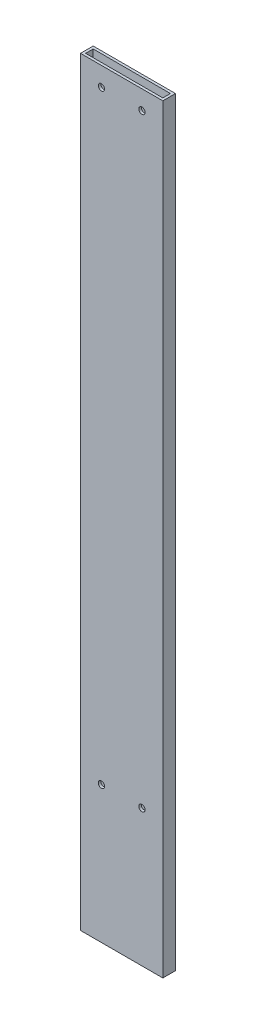
ISO-10303-21;
HEADER;
FILE_DESCRIPTION(('STEP AP214'),'2;1');
FILE_NAME('part.step','',(''),(''),'','','');
FILE_SCHEMA(('AUTOMOTIVE_DESIGN { 1 0 10303 214 1 1 1 1 }'));
ENDSEC;
DATA;
#1=APPLICATION_CONTEXT('core data for automotive mechanical design processes');
#2=APPLICATION_PROTOCOL_DEFINITION('international standard','automotive_design',2000,#1);
#3=PRODUCT_CONTEXT('',#1,'mechanical');
#4=PRODUCT('Part','Part','',(#3));
#5=PRODUCT_RELATED_PRODUCT_CATEGORY('part','',(#4));
#6=PRODUCT_DEFINITION_FORMATION('','',#4);
#7=PRODUCT_DEFINITION_CONTEXT('part definition',#1,'design');
#8=PRODUCT_DEFINITION('design','',#6,#7);
#9=PRODUCT_DEFINITION_SHAPE('','',#8);
#10=(LENGTH_UNIT() NAMED_UNIT(*) SI_UNIT(.MILLI.,.METRE.));
#11=(NAMED_UNIT(*) PLANE_ANGLE_UNIT() SI_UNIT($,.RADIAN.));
#12=(NAMED_UNIT(*) SI_UNIT($,.STERADIAN.) SOLID_ANGLE_UNIT());
#13=UNCERTAINTY_MEASURE_WITH_UNIT(LENGTH_MEASURE(1.E-05),#10,'distance_accuracy_value','');
#14=(GEOMETRIC_REPRESENTATION_CONTEXT(3) GLOBAL_UNCERTAINTY_ASSIGNED_CONTEXT((#13)) GLOBAL_UNIT_ASSIGNED_CONTEXT((#10,
#11,#12)) REPRESENTATION_CONTEXT('',''));
#15=CARTESIAN_POINT('',(0.,0.,0.));
#16=DIRECTION('',(0.,0.,1.));
#17=DIRECTION('',(1.,0.,0.));
#18=AXIS2_PLACEMENT_3D('',#15,#16,#17);
#19=CARTESIAN_POINT('',(0.,600.,0.));
#20=DIRECTION('',(0.,-1.,0.));
#21=DIRECTION('',(0.,0.,-1.));
#22=AXIS2_PLACEMENT_3D('',#19,#20,#21);
#23=PLANE('',#22);
#24=DIRECTION('',(0.,0.,-1.));
#25=VECTOR('',#24,1.);
#26=CARTESIAN_POINT('',(32.5,600.,5.));
#27=LINE('',#26,#25);
#28=CARTESIAN_POINT('',(32.5,600.,5.));
#29=VERTEX_POINT('',#28);
#30=CARTESIAN_POINT('',(32.5,600.,-5.));
#31=VERTEX_POINT('',#30);
#32=EDGE_CURVE('E142',#29,#31,#27,.T.);
#33=ORIENTED_EDGE('',*,*,#32,.T.);
#34=DIRECTION('',(-1.,0.,0.));
#35=VECTOR('',#34,1.);
#36=CARTESIAN_POINT('',(-32.5,600.,-5.));
#37=LINE('',#36,#35);
#38=CARTESIAN_POINT('',(-32.5,600.,-5.));
#39=VERTEX_POINT('',#38);
#40=EDGE_CURVE('E145',#31,#39,#37,.T.);
#41=ORIENTED_EDGE('',*,*,#40,.T.);
#42=DIRECTION('',(0.,0.,1.));
#43=VECTOR('',#42,1.);
#44=CARTESIAN_POINT('',(-32.5,600.,5.));
#45=LINE('',#44,#43);
#46=CARTESIAN_POINT('',(-32.5,600.,5.));
#47=VERTEX_POINT('',#46);
#48=EDGE_CURVE('E148',#39,#47,#45,.T.);
#49=ORIENTED_EDGE('',*,*,#48,.T.);
#50=DIRECTION('',(1.,0.,0.));
#51=VECTOR('',#50,1.);
#52=CARTESIAN_POINT('',(-32.5,600.,5.));
#53=LINE('',#52,#51);
#54=EDGE_CURVE('E150',#47,#29,#53,.T.);
#55=ORIENTED_EDGE('',*,*,#54,.T.);
#56=EDGE_LOOP('',(#33,#41,#49,#55));
#57=FACE_BOUND('',#56,.T.);
#58=DIRECTION('',(0.,0.,1.));
#59=VECTOR('',#58,1.);
#60=CARTESIAN_POINT('',(-30.5,600.,3.));
#61=LINE('',#60,#59);
#62=CARTESIAN_POINT('',(-30.5,600.,-3.));
#63=VERTEX_POINT('',#62);
#64=CARTESIAN_POINT('',(-30.5,600.,3.));
#65=VERTEX_POINT('',#64);
#66=EDGE_CURVE('E104',#63,#65,#61,.T.);
#67=ORIENTED_EDGE('',*,*,#66,.F.);
#68=DIRECTION('',(-1.,0.,0.));
#69=VECTOR('',#68,1.);
#70=CARTESIAN_POINT('',(-30.5,600.,-3.));
#71=LINE('',#70,#69);
#72=CARTESIAN_POINT('',(30.5,600.,-3.));
#73=VERTEX_POINT('',#72);
#74=EDGE_CURVE('E126',#73,#63,#71,.T.);
#75=ORIENTED_EDGE('',*,*,#74,.F.);
#76=DIRECTION('',(0.,0.,-1.));
#77=VECTOR('',#76,1.);
#78=CARTESIAN_POINT('',(30.5,600.,3.));
#79=LINE('',#78,#77);
#80=CARTESIAN_POINT('',(30.5,600.,3.));
#81=VERTEX_POINT('',#80);
#82=EDGE_CURVE('E124',#81,#73,#79,.T.);
#83=ORIENTED_EDGE('',*,*,#82,.F.);
#84=DIRECTION('',(1.,0.,0.));
#85=VECTOR('',#84,1.);
#86=CARTESIAN_POINT('',(-30.5,600.,3.));
#87=LINE('',#86,#85);
#88=EDGE_CURVE('E112',#65,#81,#87,.T.);
#89=ORIENTED_EDGE('',*,*,#88,.F.);
#90=EDGE_LOOP('',(#67,#75,#83,#89));
#91=FACE_BOUND('',#90,.T.);
#92=ADVANCED_FACE('F37',(#57,#91),#23,.F.);
#93=CARTESIAN_POINT('',(0.,0.,0.));
#94=DIRECTION('',(0.,-1.,0.));
#95=DIRECTION('',(0.,0.,-1.));
#96=AXIS2_PLACEMENT_3D('',#93,#94,#95);
#97=PLANE('',#96);
#98=DIRECTION('',(0.,0.,-1.));
#99=VECTOR('',#98,1.);
#100=CARTESIAN_POINT('',(32.5,0.,5.));
#101=LINE('',#100,#99);
#102=CARTESIAN_POINT('',(32.5,0.,5.));
#103=VERTEX_POINT('',#102);
#104=CARTESIAN_POINT('',(32.5,0.,-5.));
#105=VERTEX_POINT('',#104);
#106=EDGE_CURVE('E120',#103,#105,#101,.T.);
#107=ORIENTED_EDGE('',*,*,#106,.F.);
#108=DIRECTION('',(1.,0.,0.));
#109=VECTOR('',#108,1.);
#110=CARTESIAN_POINT('',(-32.5,0.,5.));
#111=LINE('',#110,#109);
#112=CARTESIAN_POINT('',(-32.5,0.,5.));
#113=VERTEX_POINT('',#112);
#114=EDGE_CURVE('E146',#113,#103,#111,.T.);
#115=ORIENTED_EDGE('',*,*,#114,.F.);
#116=DIRECTION('',(0.,0.,1.));
#117=VECTOR('',#116,1.);
#118=CARTESIAN_POINT('',(-32.5,0.,5.));
#119=LINE('',#118,#117);
#120=CARTESIAN_POINT('',(-32.5,0.,-5.));
#121=VERTEX_POINT('',#120);
#122=EDGE_CURVE('E157',#121,#113,#119,.T.);
#123=ORIENTED_EDGE('',*,*,#122,.F.);
#124=DIRECTION('',(-1.,0.,0.));
#125=VECTOR('',#124,1.);
#126=CARTESIAN_POINT('',(-32.5,0.,-5.));
#127=LINE('',#126,#125);
#128=EDGE_CURVE('E155',#105,#121,#127,.T.);
#129=ORIENTED_EDGE('',*,*,#128,.F.);
#130=EDGE_LOOP('',(#107,#115,#123,#129));
#131=FACE_BOUND('',#130,.T.);
#132=DIRECTION('',(-1.,0.,0.));
#133=VECTOR('',#132,1.);
#134=CARTESIAN_POINT('',(-30.5,0.,-3.));
#135=LINE('',#134,#133);
#136=CARTESIAN_POINT('',(30.5,0.,-3.));
#137=VERTEX_POINT('',#136);
#138=CARTESIAN_POINT('',(-30.5,0.,-3.));
#139=VERTEX_POINT('',#138);
#140=EDGE_CURVE('E113',#137,#139,#135,.T.);
#141=ORIENTED_EDGE('',*,*,#140,.T.);
#142=DIRECTION('',(0.,0.,1.));
#143=VECTOR('',#142,1.);
#144=CARTESIAN_POINT('',(-30.5,0.,3.));
#145=LINE('',#144,#143);
#146=CARTESIAN_POINT('',(-30.5,0.,3.));
#147=VERTEX_POINT('',#146);
#148=EDGE_CURVE('E62',#139,#147,#145,.T.);
#149=ORIENTED_EDGE('',*,*,#148,.T.);
#150=DIRECTION('',(1.,0.,0.));
#151=VECTOR('',#150,1.);
#152=CARTESIAN_POINT('',(-30.5,0.,3.));
#153=LINE('',#152,#151);
#154=CARTESIAN_POINT('',(30.5,0.,3.));
#155=VERTEX_POINT('',#154);
#156=EDGE_CURVE('E119',#147,#155,#153,.T.);
#157=ORIENTED_EDGE('',*,*,#156,.T.);
#158=DIRECTION('',(0.,0.,-1.));
#159=VECTOR('',#158,1.);
#160=CARTESIAN_POINT('',(30.5,0.,3.));
#161=LINE('',#160,#159);
#162=EDGE_CURVE('E134',#155,#137,#161,.T.);
#163=ORIENTED_EDGE('',*,*,#162,.T.);
#164=EDGE_LOOP('',(#141,#149,#157,#163));
#165=FACE_BOUND('',#164,.T.);
#166=ADVANCED_FACE('F226',(#131,#165),#97,.T.);
#167=CARTESIAN_POINT('',(32.5,600.,5.));
#168=DIRECTION('',(-1.,0.,0.));
#169=DIRECTION('',(0.,0.,1.));
#170=AXIS2_PLACEMENT_3D('',#167,#168,#169);
#171=PLANE('',#170);
#172=ORIENTED_EDGE('',*,*,#106,.T.);
#173=DIRECTION('',(0.,-1.,0.));
#174=VECTOR('',#173,1.);
#175=CARTESIAN_POINT('',(32.5,600.,-5.));
#176=LINE('',#175,#174);
#177=EDGE_CURVE('E11',#31,#105,#176,.T.);
#178=ORIENTED_EDGE('',*,*,#177,.F.);
#179=ORIENTED_EDGE('',*,*,#32,.F.);
#180=DIRECTION('',(0.,-1.,0.));
#181=VECTOR('',#180,1.);
#182=CARTESIAN_POINT('',(32.5,600.,5.));
#183=LINE('',#182,#181);
#184=EDGE_CURVE('E152',#29,#103,#183,.T.);
#185=ORIENTED_EDGE('',*,*,#184,.T.);
#186=EDGE_LOOP('',(#172,#178,#179,#185));
#187=FACE_BOUND('',#186,.T.);
#188=ADVANCED_FACE('F39',(#187),#171,.F.);
#189=CARTESIAN_POINT('',(-32.5,600.,-5.));
#190=DIRECTION('',(0.,0.,1.));
#191=DIRECTION('',(1.,0.,0.));
#192=AXIS2_PLACEMENT_3D('',#189,#190,#191);
#193=PLANE('',#192);
#194=CARTESIAN_POINT('',(16.,108.,-5.));
#195=DIRECTION('',(0.,0.,1.));
#196=DIRECTION('',(1.,0.,0.));
#197=AXIS2_PLACEMENT_3D('',#194,#195,#196);
#198=CIRCLE('',#197,2.5);
#199=CARTESIAN_POINT('',(18.5,108.,-5.));
#200=VERTEX_POINT('',#199);
#201=EDGE_CURVE('E132',#200,#200,#198,.T.);
#202=ORIENTED_EDGE('',*,*,#201,.T.);
#203=EDGE_LOOP('',(#202));
#204=FACE_BOUND('',#203,.T.);
#205=CARTESIAN_POINT('',(-16.,585.,-5.));
#206=DIRECTION('',(0.,0.,1.));
#207=DIRECTION('',(1.,0.,0.));
#208=AXIS2_PLACEMENT_3D('',#205,#206,#207);
#209=CIRCLE('',#208,2.5);
#210=CARTESIAN_POINT('',(-13.5,585.,-5.));
#211=VERTEX_POINT('',#210);
#212=EDGE_CURVE('E183',#211,#211,#209,.T.);
#213=ORIENTED_EDGE('',*,*,#212,.T.);
#214=EDGE_LOOP('',(#213));
#215=FACE_BOUND('',#214,.T.);
#216=CARTESIAN_POINT('',(16.,585.,-5.));
#217=DIRECTION('',(0.,0.,1.));
#218=DIRECTION('',(1.,0.,0.));
#219=AXIS2_PLACEMENT_3D('',#216,#217,#218);
#220=CIRCLE('',#219,2.5);
#221=CARTESIAN_POINT('',(18.5,585.,-5.));
#222=VERTEX_POINT('',#221);
#223=EDGE_CURVE('E179',#222,#222,#220,.T.);
#224=ORIENTED_EDGE('',*,*,#223,.T.);
#225=EDGE_LOOP('',(#224));
#226=FACE_BOUND('',#225,.T.);
#227=CARTESIAN_POINT('',(-16.,108.,-5.));
#228=DIRECTION('',(0.,0.,1.));
#229=DIRECTION('',(1.,0.,0.));
#230=AXIS2_PLACEMENT_3D('',#227,#228,#229);
#231=CIRCLE('',#230,2.5);
#232=CARTESIAN_POINT('',(-13.5,108.,-5.));
#233=VERTEX_POINT('',#232);
#234=EDGE_CURVE('E175',#233,#233,#231,.T.);
#235=ORIENTED_EDGE('',*,*,#234,.T.);
#236=EDGE_LOOP('',(#235));
#237=FACE_BOUND('',#236,.T.);
#238=ORIENTED_EDGE('',*,*,#128,.T.);
#239=DIRECTION('',(0.,-1.,0.));
#240=VECTOR('',#239,1.);
#241=CARTESIAN_POINT('',(-32.5,600.,-5.));
#242=LINE('',#241,#240);
#243=EDGE_CURVE('E46',#39,#121,#242,.T.);
#244=ORIENTED_EDGE('',*,*,#243,.F.);
#245=ORIENTED_EDGE('',*,*,#40,.F.);
#246=ORIENTED_EDGE('',*,*,#177,.T.);
#247=EDGE_LOOP('',(#238,#244,#245,#246));
#248=FACE_BOUND('',#247,.T.);
#249=ADVANCED_FACE('F200',(#204,#215,#226,#237,#248),#193,.F.);
#250=CARTESIAN_POINT('',(-32.5,600.,5.));
#251=DIRECTION('',(1.,0.,0.));
#252=DIRECTION('',(0.,0.,-1.));
#253=AXIS2_PLACEMENT_3D('',#250,#251,#252);
#254=PLANE('',#253);
#255=ORIENTED_EDGE('',*,*,#122,.T.);
#256=DIRECTION('',(0.,-1.,0.));
#257=VECTOR('',#256,1.);
#258=CARTESIAN_POINT('',(-32.5,600.,5.));
#259=LINE('',#258,#257);
#260=EDGE_CURVE('E162',#47,#113,#259,.T.);
#261=ORIENTED_EDGE('',*,*,#260,.F.);
#262=ORIENTED_EDGE('',*,*,#48,.F.);
#263=ORIENTED_EDGE('',*,*,#243,.T.);
#264=EDGE_LOOP('',(#255,#261,#262,#263));
#265=FACE_BOUND('',#264,.T.);
#266=ADVANCED_FACE('F240',(#265),#254,.F.);
#267=CARTESIAN_POINT('',(-32.5,600.,5.));
#268=DIRECTION('',(0.,0.,-1.));
#269=DIRECTION('',(-1.,0.,0.));
#270=AXIS2_PLACEMENT_3D('',#267,#268,#269);
#271=PLANE('',#270);
#272=CARTESIAN_POINT('',(16.,108.,5.));
#273=DIRECTION('',(0.,0.,1.));
#274=DIRECTION('',(-1.,0.,0.));
#275=AXIS2_PLACEMENT_3D('',#272,#273,#274);
#276=CIRCLE('',#275,2.5);
#277=CARTESIAN_POINT('',(13.5,108.,5.));
#278=VERTEX_POINT('',#277);
#279=EDGE_CURVE('E297',#278,#278,#276,.T.);
#280=ORIENTED_EDGE('',*,*,#279,.F.);
#281=EDGE_LOOP('',(#280));
#282=FACE_BOUND('',#281,.T.);
#283=CARTESIAN_POINT('',(-16.,585.,5.));
#284=DIRECTION('',(0.,0.,1.));
#285=DIRECTION('',(1.,0.,0.));
#286=AXIS2_PLACEMENT_3D('',#283,#284,#285);
#287=CIRCLE('',#286,2.5);
#288=CARTESIAN_POINT('',(-13.5,585.,5.));
#289=VERTEX_POINT('',#288);
#290=EDGE_CURVE('E298',#289,#289,#287,.T.);
#291=ORIENTED_EDGE('',*,*,#290,.F.);
#292=EDGE_LOOP('',(#291));
#293=FACE_BOUND('',#292,.T.);
#294=CARTESIAN_POINT('',(16.,585.,5.));
#295=DIRECTION('',(0.,0.,1.));
#296=DIRECTION('',(-1.,0.,0.));
#297=AXIS2_PLACEMENT_3D('',#294,#295,#296);
#298=CIRCLE('',#297,2.5);
#299=CARTESIAN_POINT('',(13.5,585.,5.));
#300=VERTEX_POINT('',#299);
#301=EDGE_CURVE('E301',#300,#300,#298,.T.);
#302=ORIENTED_EDGE('',*,*,#301,.F.);
#303=EDGE_LOOP('',(#302));
#304=FACE_BOUND('',#303,.T.);
#305=CARTESIAN_POINT('',(-16.,108.,5.));
#306=DIRECTION('',(0.,0.,1.));
#307=DIRECTION('',(1.,0.,0.));
#308=AXIS2_PLACEMENT_3D('',#305,#306,#307);
#309=CIRCLE('',#308,2.5);
#310=CARTESIAN_POINT('',(-13.5,108.,5.));
#311=VERTEX_POINT('',#310);
#312=EDGE_CURVE('E171',#311,#311,#309,.T.);
#313=ORIENTED_EDGE('',*,*,#312,.F.);
#314=EDGE_LOOP('',(#313));
#315=FACE_BOUND('',#314,.T.);
#316=ORIENTED_EDGE('',*,*,#114,.T.);
#317=ORIENTED_EDGE('',*,*,#184,.F.);
#318=ORIENTED_EDGE('',*,*,#54,.F.);
#319=ORIENTED_EDGE('',*,*,#260,.T.);
#320=EDGE_LOOP('',(#316,#317,#318,#319));
#321=FACE_BOUND('',#320,.T.);
#322=ADVANCED_FACE('F237',(#282,#293,#304,#315,#321),#271,.F.);
#323=CARTESIAN_POINT('',(-30.5,600.,3.));
#324=DIRECTION('',(1.,0.,0.));
#325=DIRECTION('',(0.,0.,-1.));
#326=AXIS2_PLACEMENT_3D('',#323,#324,#325);
#327=PLANE('',#326);
#328=ORIENTED_EDGE('',*,*,#148,.F.);
#329=DIRECTION('',(0.,-1.,0.));
#330=VECTOR('',#329,1.);
#331=CARTESIAN_POINT('',(-30.5,600.,-3.));
#332=LINE('',#331,#330);
#333=EDGE_CURVE('E108',#63,#139,#332,.T.);
#334=ORIENTED_EDGE('',*,*,#333,.F.);
#335=ORIENTED_EDGE('',*,*,#66,.T.);
#336=DIRECTION('',(0.,-1.,0.));
#337=VECTOR('',#336,1.);
#338=CARTESIAN_POINT('',(-30.5,600.,3.));
#339=LINE('',#338,#337);
#340=EDGE_CURVE('E107',#65,#147,#339,.T.);
#341=ORIENTED_EDGE('',*,*,#340,.T.);
#342=EDGE_LOOP('',(#328,#334,#335,#341));
#343=FACE_BOUND('',#342,.T.);
#344=ADVANCED_FACE('F106',(#343),#327,.T.);
#345=CARTESIAN_POINT('',(-30.5,600.,3.));
#346=DIRECTION('',(0.,0.,-1.));
#347=DIRECTION('',(-1.,0.,0.));
#348=AXIS2_PLACEMENT_3D('',#345,#346,#347);
#349=PLANE('',#348);
#350=CARTESIAN_POINT('',(16.,108.,3.));
#351=DIRECTION('',(0.,0.,-1.));
#352=DIRECTION('',(-1.,0.,0.));
#353=AXIS2_PLACEMENT_3D('',#350,#351,#352);
#354=CIRCLE('',#353,2.5);
#355=CARTESIAN_POINT('',(13.5,108.,3.));
#356=VERTEX_POINT('',#355);
#357=EDGE_CURVE('E195',#356,#356,#354,.T.);
#358=ORIENTED_EDGE('',*,*,#357,.F.);
#359=EDGE_LOOP('',(#358));
#360=FACE_BOUND('',#359,.T.);
#361=CARTESIAN_POINT('',(-16.,585.,3.));
#362=DIRECTION('',(0.,0.,-1.));
#363=DIRECTION('',(-1.,0.,0.));
#364=AXIS2_PLACEMENT_3D('',#361,#362,#363);
#365=CIRCLE('',#364,2.5);
#366=CARTESIAN_POINT('',(-18.5,585.,3.));
#367=VERTEX_POINT('',#366);
#368=EDGE_CURVE('E178',#367,#367,#365,.T.);
#369=ORIENTED_EDGE('',*,*,#368,.F.);
#370=EDGE_LOOP('',(#369));
#371=FACE_BOUND('',#370,.T.);
#372=CARTESIAN_POINT('',(16.,585.,3.));
#373=DIRECTION('',(0.,0.,-1.));
#374=DIRECTION('',(-1.,0.,0.));
#375=AXIS2_PLACEMENT_3D('',#372,#373,#374);
#376=CIRCLE('',#375,2.5);
#377=CARTESIAN_POINT('',(13.5,585.,3.));
#378=VERTEX_POINT('',#377);
#379=EDGE_CURVE('E174',#378,#378,#376,.T.);
#380=ORIENTED_EDGE('',*,*,#379,.F.);
#381=EDGE_LOOP('',(#380));
#382=FACE_BOUND('',#381,.T.);
#383=CARTESIAN_POINT('',(-16.,108.,3.));
#384=DIRECTION('',(0.,0.,-1.));
#385=DIRECTION('',(-1.,0.,0.));
#386=AXIS2_PLACEMENT_3D('',#383,#384,#385);
#387=CIRCLE('',#386,2.5);
#388=CARTESIAN_POINT('',(-18.5,108.,3.));
#389=VERTEX_POINT('',#388);
#390=EDGE_CURVE('E170',#389,#389,#387,.T.);
#391=ORIENTED_EDGE('',*,*,#390,.F.);
#392=EDGE_LOOP('',(#391));
#393=FACE_BOUND('',#392,.T.);
#394=ORIENTED_EDGE('',*,*,#156,.F.);
#395=ORIENTED_EDGE('',*,*,#340,.F.);
#396=ORIENTED_EDGE('',*,*,#88,.T.);
#397=DIRECTION('',(0.,-1.,0.));
#398=VECTOR('',#397,1.);
#399=CARTESIAN_POINT('',(30.5,600.,3.));
#400=LINE('',#399,#398);
#401=EDGE_CURVE('E121',#81,#155,#400,.T.);
#402=ORIENTED_EDGE('',*,*,#401,.T.);
#403=EDGE_LOOP('',(#394,#395,#396,#402));
#404=FACE_BOUND('',#403,.T.);
#405=ADVANCED_FACE('F116',(#360,#371,#382,#393,#404),#349,.T.);
#406=CARTESIAN_POINT('',(30.5,600.,3.));
#407=DIRECTION('',(-1.,0.,0.));
#408=DIRECTION('',(0.,0.,1.));
#409=AXIS2_PLACEMENT_3D('',#406,#407,#408);
#410=PLANE('',#409);
#411=ORIENTED_EDGE('',*,*,#162,.F.);
#412=ORIENTED_EDGE('',*,*,#401,.F.);
#413=ORIENTED_EDGE('',*,*,#82,.T.);
#414=DIRECTION('',(0.,-1.,0.));
#415=VECTOR('',#414,1.);
#416=CARTESIAN_POINT('',(30.5,600.,-3.));
#417=LINE('',#416,#415);
#418=EDGE_CURVE('E54',#73,#137,#417,.T.);
#419=ORIENTED_EDGE('',*,*,#418,.T.);
#420=EDGE_LOOP('',(#411,#412,#413,#419));
#421=FACE_BOUND('',#420,.T.);
#422=ADVANCED_FACE('F267',(#421),#410,.T.);
#423=CARTESIAN_POINT('',(-30.5,600.,-3.));
#424=DIRECTION('',(0.,0.,1.));
#425=DIRECTION('',(1.,0.,0.));
#426=AXIS2_PLACEMENT_3D('',#423,#424,#425);
#427=PLANE('',#426);
#428=CARTESIAN_POINT('',(16.,108.,-3.));
#429=DIRECTION('',(0.,0.,1.));
#430=DIRECTION('',(1.,0.,0.));
#431=AXIS2_PLACEMENT_3D('',#428,#429,#430);
#432=CIRCLE('',#431,2.5);
#433=CARTESIAN_POINT('',(18.5,108.,-3.));
#434=VERTEX_POINT('',#433);
#435=EDGE_CURVE('E41',#434,#434,#432,.T.);
#436=ORIENTED_EDGE('',*,*,#435,.F.);
#437=EDGE_LOOP('',(#436));
#438=FACE_BOUND('',#437,.T.);
#439=CARTESIAN_POINT('',(-16.,585.,-3.));
#440=DIRECTION('',(0.,0.,1.));
#441=DIRECTION('',(1.,0.,0.));
#442=AXIS2_PLACEMENT_3D('',#439,#440,#441);
#443=CIRCLE('',#442,2.5);
#444=CARTESIAN_POINT('',(-13.5,585.,-3.));
#445=VERTEX_POINT('',#444);
#446=EDGE_CURVE('E176',#445,#445,#443,.T.);
#447=ORIENTED_EDGE('',*,*,#446,.F.);
#448=EDGE_LOOP('',(#447));
#449=FACE_BOUND('',#448,.T.);
#450=CARTESIAN_POINT('',(16.,585.,-3.));
#451=DIRECTION('',(0.,0.,1.));
#452=DIRECTION('',(1.,0.,0.));
#453=AXIS2_PLACEMENT_3D('',#450,#451,#452);
#454=CIRCLE('',#453,2.5);
#455=CARTESIAN_POINT('',(18.5,585.,-3.));
#456=VERTEX_POINT('',#455);
#457=EDGE_CURVE('E172',#456,#456,#454,.T.);
#458=ORIENTED_EDGE('',*,*,#457,.F.);
#459=EDGE_LOOP('',(#458));
#460=FACE_BOUND('',#459,.T.);
#461=CARTESIAN_POINT('',(-16.,108.,-3.));
#462=DIRECTION('',(0.,0.,1.));
#463=DIRECTION('',(1.,0.,0.));
#464=AXIS2_PLACEMENT_3D('',#461,#462,#463);
#465=CIRCLE('',#464,2.5);
#466=CARTESIAN_POINT('',(-13.5,108.,-3.));
#467=VERTEX_POINT('',#466);
#468=EDGE_CURVE('E167',#467,#467,#465,.T.);
#469=ORIENTED_EDGE('',*,*,#468,.F.);
#470=EDGE_LOOP('',(#469));
#471=FACE_BOUND('',#470,.T.);
#472=ORIENTED_EDGE('',*,*,#140,.F.);
#473=ORIENTED_EDGE('',*,*,#418,.F.);
#474=ORIENTED_EDGE('',*,*,#74,.T.);
#475=ORIENTED_EDGE('',*,*,#333,.T.);
#476=EDGE_LOOP('',(#472,#473,#474,#475));
#477=FACE_BOUND('',#476,.T.);
#478=ADVANCED_FACE('F265',(#438,#449,#460,#471,#477),#427,.T.);
#479=CARTESIAN_POINT('',(-16.,108.,-595.));
#480=DIRECTION('',(0.,0.,1.));
#481=DIRECTION('',(1.,0.,0.));
#482=AXIS2_PLACEMENT_3D('',#479,#480,#481);
#483=CYLINDRICAL_SURFACE('',#482,2.5);
#484=ORIENTED_EDGE('',*,*,#468,.T.);
#485=EDGE_LOOP('',(#484));
#486=FACE_BOUND('',#485,.T.);
#487=ORIENTED_EDGE('',*,*,#234,.F.);
#488=EDGE_LOOP('',(#487));
#489=FACE_BOUND('',#488,.T.);
#490=ADVANCED_FACE('F217',(#486,#489),#483,.F.);
#491=CARTESIAN_POINT('',(16.,585.,-595.));
#492=DIRECTION('',(0.,0.,1.));
#493=DIRECTION('',(1.,0.,0.));
#494=AXIS2_PLACEMENT_3D('',#491,#492,#493);
#495=CYLINDRICAL_SURFACE('',#494,2.5);
#496=ORIENTED_EDGE('',*,*,#457,.T.);
#497=EDGE_LOOP('',(#496));
#498=FACE_BOUND('',#497,.T.);
#499=ORIENTED_EDGE('',*,*,#223,.F.);
#500=EDGE_LOOP('',(#499));
#501=FACE_BOUND('',#500,.T.);
#502=ADVANCED_FACE('F218',(#498,#501),#495,.F.);
#503=CARTESIAN_POINT('',(-16.,585.,-595.));
#504=DIRECTION('',(0.,0.,1.));
#505=DIRECTION('',(1.,0.,0.));
#506=AXIS2_PLACEMENT_3D('',#503,#504,#505);
#507=CYLINDRICAL_SURFACE('',#506,2.5);
#508=ORIENTED_EDGE('',*,*,#446,.T.);
#509=EDGE_LOOP('',(#508));
#510=FACE_BOUND('',#509,.T.);
#511=ORIENTED_EDGE('',*,*,#212,.F.);
#512=EDGE_LOOP('',(#511));
#513=FACE_BOUND('',#512,.T.);
#514=ADVANCED_FACE('F206',(#510,#513),#507,.F.);
#515=CARTESIAN_POINT('',(16.,108.,-595.));
#516=DIRECTION('',(0.,0.,1.));
#517=DIRECTION('',(1.,0.,0.));
#518=AXIS2_PLACEMENT_3D('',#515,#516,#517);
#519=CYLINDRICAL_SURFACE('',#518,2.5);
#520=ORIENTED_EDGE('',*,*,#435,.T.);
#521=EDGE_LOOP('',(#520));
#522=FACE_BOUND('',#521,.T.);
#523=ORIENTED_EDGE('',*,*,#201,.F.);
#524=EDGE_LOOP('',(#523));
#525=FACE_BOUND('',#524,.T.);
#526=ADVANCED_FACE('F203',(#522,#525),#519,.F.);
#527=ORIENTED_EDGE('',*,*,#390,.T.);
#528=EDGE_LOOP('',(#527));
#529=FACE_BOUND('',#528,.T.);
#530=ORIENTED_EDGE('',*,*,#312,.T.);
#531=EDGE_LOOP('',(#530));
#532=FACE_BOUND('',#531,.T.);
#533=ADVANCED_FACE('F205',(#529,#532),#483,.F.);
#534=ORIENTED_EDGE('',*,*,#379,.T.);
#535=EDGE_LOOP('',(#534));
#536=FACE_BOUND('',#535,.T.);
#537=ORIENTED_EDGE('',*,*,#301,.T.);
#538=EDGE_LOOP('',(#537));
#539=FACE_BOUND('',#538,.T.);
#540=ADVANCED_FACE('F214',(#536,#539),#495,.F.);
#541=ORIENTED_EDGE('',*,*,#368,.T.);
#542=EDGE_LOOP('',(#541));
#543=FACE_BOUND('',#542,.T.);
#544=ORIENTED_EDGE('',*,*,#290,.T.);
#545=EDGE_LOOP('',(#544));
#546=FACE_BOUND('',#545,.T.);
#547=ADVANCED_FACE('F220',(#543,#546),#507,.F.);
#548=ORIENTED_EDGE('',*,*,#357,.T.);
#549=EDGE_LOOP('',(#548));
#550=FACE_BOUND('',#549,.T.);
#551=ORIENTED_EDGE('',*,*,#279,.T.);
#552=EDGE_LOOP('',(#551));
#553=FACE_BOUND('',#552,.T.);
#554=ADVANCED_FACE('F209',(#550,#553),#519,.F.);
#555=CLOSED_SHELL('',(#92,#166,#188,#249,#266,#322,#344,#405,#422,#478,#490,#502,#514,#526,#533,
#540,#547,#554));
#556=MANIFOLD_SOLID_BREP('B2',#555);
#557=ADVANCED_BREP_SHAPE_REPRESENTATION('',(#18,#556),#14);
#558=SHAPE_DEFINITION_REPRESENTATION(#9,#557);
ENDSEC;
END-ISO-10303-21;
